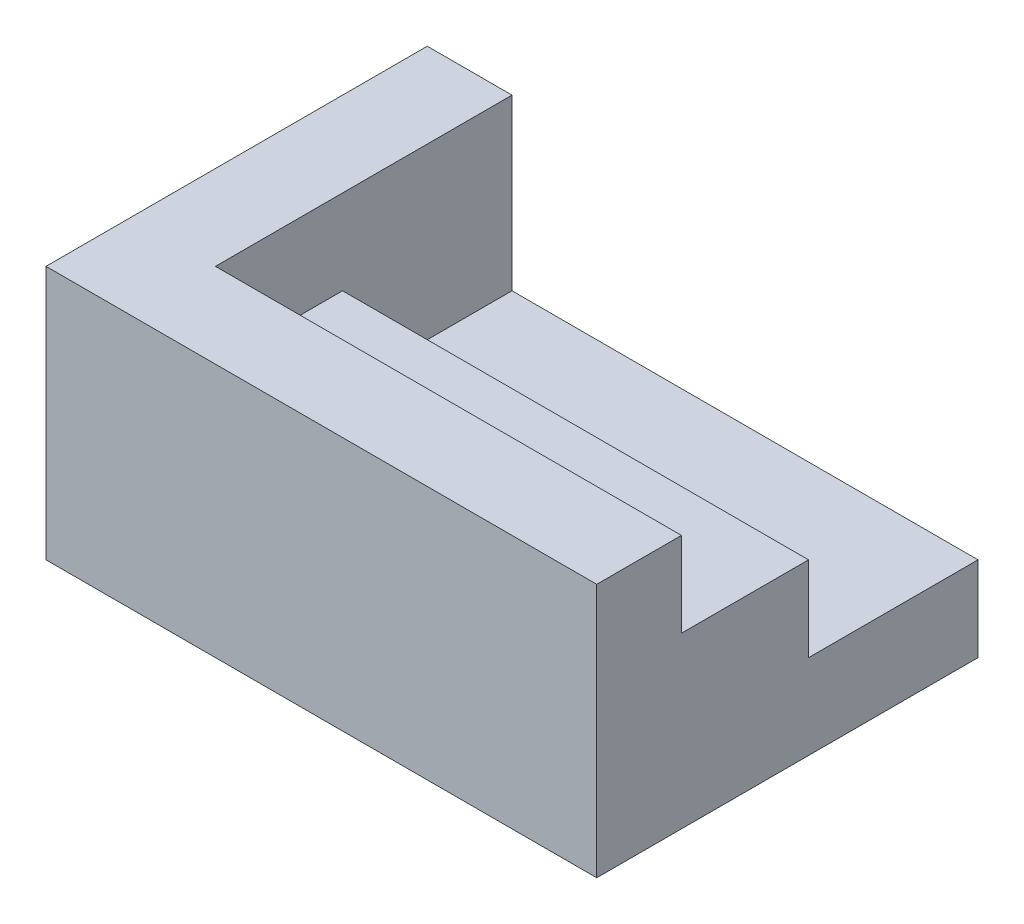
ISO-10303-21;
HEADER;
FILE_DESCRIPTION(('STEP AP214'),'2;1');
FILE_NAME('part.step','',(''),(''),'','','');
FILE_SCHEMA(('AUTOMOTIVE_DESIGN { 1 0 10303 214 1 1 1 1 }'));
ENDSEC;
DATA;
#1=APPLICATION_CONTEXT('core data for automotive mechanical design processes');
#2=APPLICATION_PROTOCOL_DEFINITION('international standard','automotive_design',2000,#1);
#3=PRODUCT_CONTEXT('',#1,'mechanical');
#4=PRODUCT('Part','Part','',(#3));
#5=PRODUCT_RELATED_PRODUCT_CATEGORY('part','',(#4));
#6=PRODUCT_DEFINITION_FORMATION('','',#4);
#7=PRODUCT_DEFINITION_CONTEXT('part definition',#1,'design');
#8=PRODUCT_DEFINITION('design','',#6,#7);
#9=PRODUCT_DEFINITION_SHAPE('','',#8);
#10=(LENGTH_UNIT() NAMED_UNIT(*) SI_UNIT(.MILLI.,.METRE.));
#11=(NAMED_UNIT(*) PLANE_ANGLE_UNIT() SI_UNIT($,.RADIAN.));
#12=(NAMED_UNIT(*) SI_UNIT($,.STERADIAN.) SOLID_ANGLE_UNIT());
#13=UNCERTAINTY_MEASURE_WITH_UNIT(LENGTH_MEASURE(1.E-05),#10,'distance_accuracy_value','');
#14=(GEOMETRIC_REPRESENTATION_CONTEXT(3) GLOBAL_UNCERTAINTY_ASSIGNED_CONTEXT((#13)) GLOBAL_UNIT_ASSIGNED_CONTEXT((#10,
#11,#12)) REPRESENTATION_CONTEXT('',''));
#15=CARTESIAN_POINT('',(0.,0.,0.));
#16=DIRECTION('',(0.,0.,1.));
#17=DIRECTION('',(1.,0.,0.));
#18=AXIS2_PLACEMENT_3D('',#15,#16,#17);
#19=CARTESIAN_POINT('',(0.,16.,0.));
#20=DIRECTION('',(0.,-1.,0.));
#21=DIRECTION('',(0.,0.,-1.));
#22=AXIS2_PLACEMENT_3D('',#19,#20,#21);
#23=PLANE('',#22);
#24=DIRECTION('',(-1.,0.,0.));
#25=VECTOR('',#24,1.);
#26=CARTESIAN_POINT('',(16.,16.,-40.));
#27=LINE('',#26,#25);
#28=CARTESIAN_POINT('',(104.,16.,-40.));
#29=VERTEX_POINT('',#28);
#30=CARTESIAN_POINT('',(16.,16.,-40.));
#31=VERTEX_POINT('',#30);
#32=EDGE_CURVE('E182',#29,#31,#27,.T.);
#33=ORIENTED_EDGE('',*,*,#32,.F.);
#34=DIRECTION('',(0.,0.,-1.));
#35=VECTOR('',#34,1.);
#36=CARTESIAN_POINT('',(104.,16.,0.));
#37=LINE('',#36,#35);
#38=CARTESIAN_POINT('',(104.,16.,-72.));
#39=VERTEX_POINT('',#38);
#40=EDGE_CURVE('E57',#29,#39,#37,.T.);
#41=ORIENTED_EDGE('',*,*,#40,.T.);
#42=DIRECTION('',(-1.,0.,0.));
#43=VECTOR('',#42,1.);
#44=CARTESIAN_POINT('',(0.,16.,-72.));
#45=LINE('',#44,#43);
#46=CARTESIAN_POINT('',(16.,16.,-72.));
#47=VERTEX_POINT('',#46);
#48=EDGE_CURVE('E94',#39,#47,#45,.T.);
#49=ORIENTED_EDGE('',*,*,#48,.T.);
#50=DIRECTION('',(0.,0.,1.));
#51=VECTOR('',#50,1.);
#52=CARTESIAN_POINT('',(16.,16.,0.));
#53=LINE('',#52,#51);
#54=EDGE_CURVE('E132',#47,#31,#53,.T.);
#55=ORIENTED_EDGE('',*,*,#54,.T.);
#56=EDGE_LOOP('',(#33,#41,#49,#55));
#57=FACE_BOUND('',#56,.T.);
#58=ADVANCED_FACE('F33',(#57),#23,.F.);
#59=CARTESIAN_POINT('',(104.,0.,-16.));
#60=DIRECTION('',(0.,0.,-1.));
#61=DIRECTION('',(-1.,0.,0.));
#62=AXIS2_PLACEMENT_3D('',#59,#60,#61);
#63=PLANE('',#62);
#64=DIRECTION('',(0.,-1.,0.));
#65=VECTOR('',#64,1.);
#66=CARTESIAN_POINT('',(104.,0.,-16.));
#67=LINE('',#66,#65);
#68=CARTESIAN_POINT('',(104.,48.,-16.));
#69=VERTEX_POINT('',#68);
#70=CARTESIAN_POINT('',(104.,32.,-16.));
#71=VERTEX_POINT('',#70);
#72=EDGE_CURVE('E134',#69,#71,#67,.T.);
#73=ORIENTED_EDGE('',*,*,#72,.T.);
#74=DIRECTION('',(1.,0.,0.));
#75=VECTOR('',#74,1.);
#76=CARTESIAN_POINT('',(16.,32.,-16.));
#77=LINE('',#76,#75);
#78=CARTESIAN_POINT('',(16.,32.,-16.));
#79=VERTEX_POINT('',#78);
#80=EDGE_CURVE('E150',#79,#71,#77,.T.);
#81=ORIENTED_EDGE('',*,*,#80,.F.);
#82=DIRECTION('',(0.,-1.,0.));
#83=VECTOR('',#82,1.);
#84=CARTESIAN_POINT('',(16.,0.,-16.));
#85=LINE('',#84,#83);
#86=CARTESIAN_POINT('',(16.,48.,-16.));
#87=VERTEX_POINT('',#86);
#88=EDGE_CURVE('E136',#87,#79,#85,.T.);
#89=ORIENTED_EDGE('',*,*,#88,.F.);
#90=DIRECTION('',(-1.,0.,0.));
#91=VECTOR('',#90,1.);
#92=CARTESIAN_POINT('',(104.,48.,-16.));
#93=LINE('',#92,#91);
#94=EDGE_CURVE('E111',#69,#87,#93,.T.);
#95=ORIENTED_EDGE('',*,*,#94,.F.);
#96=EDGE_LOOP('',(#73,#81,#89,#95));
#97=FACE_BOUND('',#96,.T.);
#98=ADVANCED_FACE('F146',(#97),#63,.T.);
#99=CARTESIAN_POINT('',(16.,0.,0.));
#100=DIRECTION('',(1.,0.,0.));
#101=DIRECTION('',(0.,0.,-1.));
#102=AXIS2_PLACEMENT_3D('',#99,#100,#101);
#103=PLANE('',#102);
#104=DIRECTION('',(0.,0.,1.));
#105=VECTOR('',#104,1.);
#106=CARTESIAN_POINT('',(16.,32.,-16.));
#107=LINE('',#106,#105);
#108=CARTESIAN_POINT('',(16.,32.,-40.));
#109=VERTEX_POINT('',#108);
#110=EDGE_CURVE('E179',#109,#79,#107,.T.);
#111=ORIENTED_EDGE('',*,*,#110,.F.);
#112=DIRECTION('',(0.,-1.,0.));
#113=VECTOR('',#112,1.);
#114=CARTESIAN_POINT('',(16.,32.,-40.));
#115=LINE('',#114,#113);
#116=EDGE_CURVE('E48',#109,#31,#115,.T.);
#117=ORIENTED_EDGE('',*,*,#116,.T.);
#118=ORIENTED_EDGE('',*,*,#54,.F.);
#119=DIRECTION('',(0.,-1.,0.));
#120=VECTOR('',#119,1.);
#121=CARTESIAN_POINT('',(16.,0.,-72.));
#122=LINE('',#121,#120);
#123=CARTESIAN_POINT('',(16.,48.,-72.));
#124=VERTEX_POINT('',#123);
#125=EDGE_CURVE('E193',#124,#47,#122,.T.);
#126=ORIENTED_EDGE('',*,*,#125,.F.);
#127=DIRECTION('',(0.,0.,-1.));
#128=VECTOR('',#127,1.);
#129=CARTESIAN_POINT('',(16.,48.,0.));
#130=LINE('',#129,#128);
#131=EDGE_CURVE('E160',#87,#124,#130,.T.);
#132=ORIENTED_EDGE('',*,*,#131,.F.);
#133=ORIENTED_EDGE('',*,*,#88,.T.);
#134=EDGE_LOOP('',(#111,#117,#118,#126,#132,#133));
#135=FACE_BOUND('',#134,.T.);
#136=ADVANCED_FACE('F196',(#135),#103,.T.);
#137=CARTESIAN_POINT('',(0.,16.,0.));
#138=DIRECTION('',(1.,0.,0.));
#139=DIRECTION('',(0.,0.,-1.));
#140=AXIS2_PLACEMENT_3D('',#137,#138,#139);
#141=PLANE('',#140);
#142=DIRECTION('',(0.,0.,1.));
#143=VECTOR('',#142,1.);
#144=CARTESIAN_POINT('',(0.,0.,0.));
#145=LINE('',#144,#143);
#146=CARTESIAN_POINT('',(0.,0.,-72.));
#147=VERTEX_POINT('',#146);
#148=CARTESIAN_POINT('',(0.,0.,0.));
#149=VERTEX_POINT('',#148);
#150=EDGE_CURVE('E99',#147,#149,#145,.T.);
#151=ORIENTED_EDGE('',*,*,#150,.T.);
#152=DIRECTION('',(0.,-1.,0.));
#153=VECTOR('',#152,1.);
#154=CARTESIAN_POINT('',(0.,16.,0.));
#155=LINE('',#154,#153);
#156=CARTESIAN_POINT('',(0.,48.,0.));
#157=VERTEX_POINT('',#156);
#158=EDGE_CURVE('E11',#157,#149,#155,.T.);
#159=ORIENTED_EDGE('',*,*,#158,.F.);
#160=DIRECTION('',(0.,0.,-1.));
#161=VECTOR('',#160,1.);
#162=CARTESIAN_POINT('',(0.,48.,0.));
#163=LINE('',#162,#161);
#164=CARTESIAN_POINT('',(0.,48.,-72.));
#165=VERTEX_POINT('',#164);
#166=EDGE_CURVE('E121',#157,#165,#163,.T.);
#167=ORIENTED_EDGE('',*,*,#166,.T.);
#168=DIRECTION('',(0.,-1.,0.));
#169=VECTOR('',#168,1.);
#170=CARTESIAN_POINT('',(0.,16.,-72.));
#171=LINE('',#170,#169);
#172=EDGE_CURVE('E95',#165,#147,#171,.T.);
#173=ORIENTED_EDGE('',*,*,#172,.T.);
#174=EDGE_LOOP('',(#151,#159,#167,#173));
#175=FACE_BOUND('',#174,.T.);
#176=ADVANCED_FACE('F35',(#175),#141,.F.);
#177=CARTESIAN_POINT('',(0.,16.,0.));
#178=DIRECTION('',(0.,0.,-1.));
#179=DIRECTION('',(-1.,0.,0.));
#180=AXIS2_PLACEMENT_3D('',#177,#178,#179);
#181=PLANE('',#180);
#182=DIRECTION('',(-1.,0.,0.));
#183=VECTOR('',#182,1.);
#184=CARTESIAN_POINT('',(104.,48.,0.));
#185=LINE('',#184,#183);
#186=CARTESIAN_POINT('',(104.,48.,0.));
#187=VERTEX_POINT('',#186);
#188=EDGE_CURVE('E118',#187,#157,#185,.T.);
#189=ORIENTED_EDGE('',*,*,#188,.T.);
#190=ORIENTED_EDGE('',*,*,#158,.T.);
#191=DIRECTION('',(1.,0.,0.));
#192=VECTOR('',#191,1.);
#193=CARTESIAN_POINT('',(0.,0.,0.));
#194=LINE('',#193,#192);
#195=CARTESIAN_POINT('',(104.,0.,0.));
#196=VERTEX_POINT('',#195);
#197=EDGE_CURVE('E87',#149,#196,#194,.T.);
#198=ORIENTED_EDGE('',*,*,#197,.T.);
#199=DIRECTION('',(0.,-1.,0.));
#200=VECTOR('',#199,1.);
#201=CARTESIAN_POINT('',(104.,16.,0.));
#202=LINE('',#201,#200);
#203=EDGE_CURVE('E41',#187,#196,#202,.T.);
#204=ORIENTED_EDGE('',*,*,#203,.F.);
#205=EDGE_LOOP('',(#189,#190,#198,#204));
#206=FACE_BOUND('',#205,.T.);
#207=ADVANCED_FACE('F114',(#206),#181,.F.);
#208=CARTESIAN_POINT('',(104.,16.,0.));
#209=DIRECTION('',(-1.,0.,0.));
#210=DIRECTION('',(0.,0.,1.));
#211=AXIS2_PLACEMENT_3D('',#208,#209,#210);
#212=PLANE('',#211);
#213=ORIENTED_EDGE('',*,*,#40,.F.);
#214=DIRECTION('',(0.,-1.,0.));
#215=VECTOR('',#214,1.);
#216=CARTESIAN_POINT('',(104.,32.,-40.));
#217=LINE('',#216,#215);
#218=CARTESIAN_POINT('',(104.,32.,-40.));
#219=VERTEX_POINT('',#218);
#220=EDGE_CURVE('E190',#219,#29,#217,.T.);
#221=ORIENTED_EDGE('',*,*,#220,.F.);
#222=DIRECTION('',(0.,0.,-1.));
#223=VECTOR('',#222,1.);
#224=CARTESIAN_POINT('',(104.,32.,-16.));
#225=LINE('',#224,#223);
#226=EDGE_CURVE('E157',#71,#219,#225,.T.);
#227=ORIENTED_EDGE('',*,*,#226,.F.);
#228=ORIENTED_EDGE('',*,*,#72,.F.);
#229=DIRECTION('',(0.,0.,-1.));
#230=VECTOR('',#229,1.);
#231=CARTESIAN_POINT('',(104.,48.,0.));
#232=LINE('',#231,#230);
#233=EDGE_CURVE('E131',#187,#69,#232,.T.);
#234=ORIENTED_EDGE('',*,*,#233,.F.);
#235=ORIENTED_EDGE('',*,*,#203,.T.);
#236=DIRECTION('',(0.,0.,-1.));
#237=VECTOR('',#236,1.);
#238=CARTESIAN_POINT('',(104.,0.,0.));
#239=LINE('',#238,#237);
#240=CARTESIAN_POINT('',(104.,0.,-72.));
#241=VERTEX_POINT('',#240);
#242=EDGE_CURVE('E76',#196,#241,#239,.T.);
#243=ORIENTED_EDGE('',*,*,#242,.T.);
#244=DIRECTION('',(0.,-1.,0.));
#245=VECTOR('',#244,1.);
#246=CARTESIAN_POINT('',(104.,16.,-72.));
#247=LINE('',#246,#245);
#248=EDGE_CURVE('E79',#39,#241,#247,.T.);
#249=ORIENTED_EDGE('',*,*,#248,.F.);
#250=EDGE_LOOP('',(#213,#221,#227,#228,#234,#235,#243,#249));
#251=FACE_BOUND('',#250,.T.);
#252=ADVANCED_FACE('F78',(#251),#212,.F.);
#253=CARTESIAN_POINT('',(0.,16.,-72.));
#254=DIRECTION('',(0.,0.,1.));
#255=DIRECTION('',(1.,0.,0.));
#256=AXIS2_PLACEMENT_3D('',#253,#254,#255);
#257=PLANE('',#256);
#258=DIRECTION('',(-1.,0.,0.));
#259=VECTOR('',#258,1.);
#260=CARTESIAN_POINT('',(0.,0.,-72.));
#261=LINE('',#260,#259);
#262=EDGE_CURVE('E86',#241,#147,#261,.T.);
#263=ORIENTED_EDGE('',*,*,#262,.T.);
#264=ORIENTED_EDGE('',*,*,#172,.F.);
#265=DIRECTION('',(1.,0.,0.));
#266=VECTOR('',#265,1.);
#267=CARTESIAN_POINT('',(0.,48.,-72.));
#268=LINE('',#267,#266);
#269=EDGE_CURVE('E130',#165,#124,#268,.T.);
#270=ORIENTED_EDGE('',*,*,#269,.T.);
#271=ORIENTED_EDGE('',*,*,#125,.T.);
#272=ORIENTED_EDGE('',*,*,#48,.F.);
#273=ORIENTED_EDGE('',*,*,#248,.T.);
#274=EDGE_LOOP('',(#263,#264,#270,#271,#272,#273));
#275=FACE_BOUND('',#274,.T.);
#276=ADVANCED_FACE('F90',(#275),#257,.F.);
#277=CARTESIAN_POINT('',(0.,0.,0.));
#278=DIRECTION('',(0.,-1.,0.));
#279=DIRECTION('',(0.,0.,-1.));
#280=AXIS2_PLACEMENT_3D('',#277,#278,#279);
#281=PLANE('',#280);
#282=ORIENTED_EDGE('',*,*,#242,.F.);
#283=ORIENTED_EDGE('',*,*,#197,.F.);
#284=ORIENTED_EDGE('',*,*,#150,.F.);
#285=ORIENTED_EDGE('',*,*,#262,.F.);
#286=EDGE_LOOP('',(#282,#283,#284,#285));
#287=FACE_BOUND('',#286,.T.);
#288=ADVANCED_FACE('F98',(#287),#281,.T.);
#289=CARTESIAN_POINT('',(104.,48.,0.));
#290=DIRECTION('',(0.,1.,0.));
#291=DIRECTION('',(0.,0.,1.));
#292=AXIS2_PLACEMENT_3D('',#289,#290,#291);
#293=PLANE('',#292);
#294=ORIENTED_EDGE('',*,*,#94,.T.);
#295=ORIENTED_EDGE('',*,*,#131,.T.);
#296=ORIENTED_EDGE('',*,*,#269,.F.);
#297=ORIENTED_EDGE('',*,*,#166,.F.);
#298=ORIENTED_EDGE('',*,*,#188,.F.);
#299=ORIENTED_EDGE('',*,*,#233,.T.);
#300=EDGE_LOOP('',(#294,#295,#296,#297,#298,#299));
#301=FACE_BOUND('',#300,.T.);
#302=ADVANCED_FACE('F126',(#301),#293,.T.);
#303=CARTESIAN_POINT('',(16.,32.,-40.));
#304=DIRECTION('',(0.,0.,1.));
#305=DIRECTION('',(1.,0.,0.));
#306=AXIS2_PLACEMENT_3D('',#303,#304,#305);
#307=PLANE('',#306);
#308=ORIENTED_EDGE('',*,*,#32,.T.);
#309=ORIENTED_EDGE('',*,*,#116,.F.);
#310=DIRECTION('',(-1.,0.,0.));
#311=VECTOR('',#310,1.);
#312=CARTESIAN_POINT('',(16.,32.,-40.));
#313=LINE('',#312,#311);
#314=EDGE_CURVE('E181',#219,#109,#313,.T.);
#315=ORIENTED_EDGE('',*,*,#314,.F.);
#316=ORIENTED_EDGE('',*,*,#220,.T.);
#317=EDGE_LOOP('',(#308,#309,#315,#316));
#318=FACE_BOUND('',#317,.T.);
#319=ADVANCED_FACE('F241',(#318),#307,.F.);
#320=CARTESIAN_POINT('',(0.,32.,0.));
#321=DIRECTION('',(0.,-1.,0.));
#322=DIRECTION('',(0.,0.,-1.));
#323=AXIS2_PLACEMENT_3D('',#320,#321,#322);
#324=PLANE('',#323);
#325=ORIENTED_EDGE('',*,*,#110,.T.);
#326=ORIENTED_EDGE('',*,*,#80,.T.);
#327=ORIENTED_EDGE('',*,*,#226,.T.);
#328=ORIENTED_EDGE('',*,*,#314,.T.);
#329=EDGE_LOOP('',(#325,#326,#327,#328));
#330=FACE_BOUND('',#329,.T.);
#331=ADVANCED_FACE('F180',(#330),#324,.F.);
#332=CLOSED_SHELL('',(#58,#98,#136,#176,#207,#252,#276,#288,#302,#319,#331));
#333=MANIFOLD_SOLID_BREP('B2',#332);
#334=ADVANCED_BREP_SHAPE_REPRESENTATION('',(#18,#333),#14);
#335=SHAPE_DEFINITION_REPRESENTATION(#9,#334);
ENDSEC;
END-ISO-10303-21;
